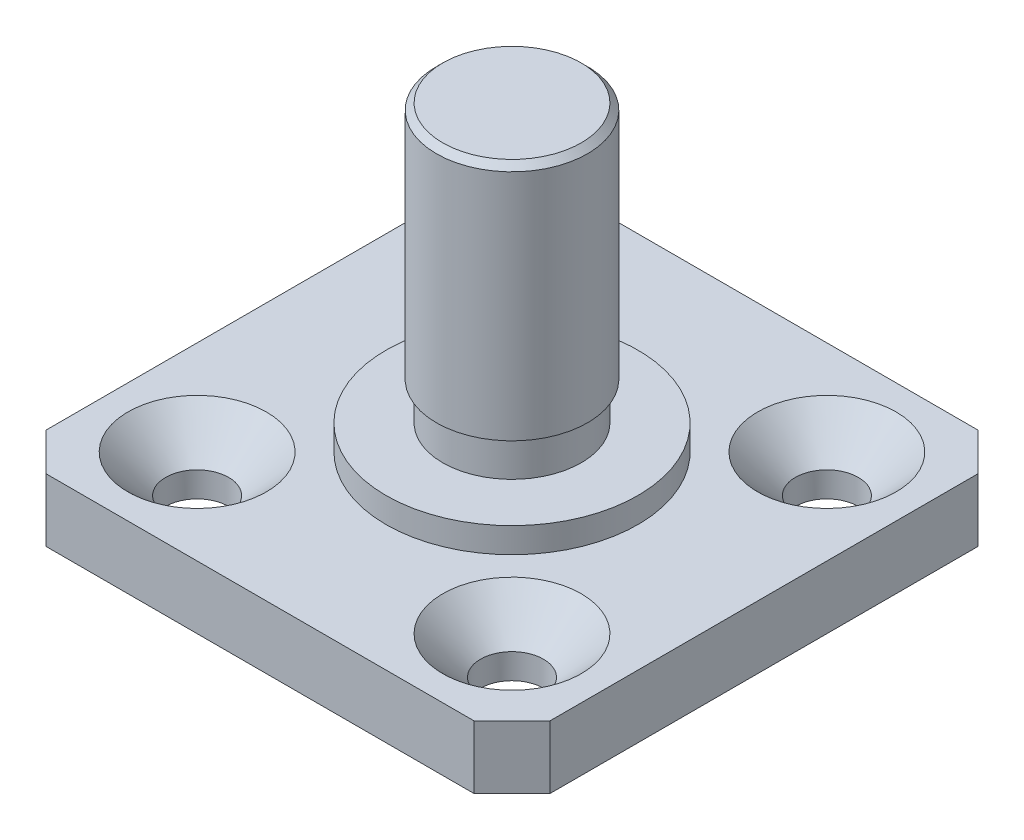
ISO-10303-21;
HEADER;
FILE_DESCRIPTION(('STEP AP214'),'2;1');
FILE_NAME('part.step','',(''),(''),'','','');
FILE_SCHEMA(('AUTOMOTIVE_DESIGN { 1 0 10303 214 1 1 1 1 }'));
ENDSEC;
DATA;
#1=APPLICATION_CONTEXT('core data for automotive mechanical design processes');
#2=APPLICATION_PROTOCOL_DEFINITION('international standard','automotive_design',2000,#1);
#3=PRODUCT_CONTEXT('',#1,'mechanical');
#4=PRODUCT('Part','Part','',(#3));
#5=PRODUCT_RELATED_PRODUCT_CATEGORY('part','',(#4));
#6=PRODUCT_DEFINITION_FORMATION('','',#4);
#7=PRODUCT_DEFINITION_CONTEXT('part definition',#1,'design');
#8=PRODUCT_DEFINITION('design','',#6,#7);
#9=PRODUCT_DEFINITION_SHAPE('','',#8);
#10=(LENGTH_UNIT() NAMED_UNIT(*) SI_UNIT(.MILLI.,.METRE.));
#11=(NAMED_UNIT(*) PLANE_ANGLE_UNIT() SI_UNIT($,.RADIAN.));
#12=(NAMED_UNIT(*) SI_UNIT($,.STERADIAN.) SOLID_ANGLE_UNIT());
#13=UNCERTAINTY_MEASURE_WITH_UNIT(LENGTH_MEASURE(1.E-05),#10,'distance_accuracy_value','');
#14=(GEOMETRIC_REPRESENTATION_CONTEXT(3) GLOBAL_UNCERTAINTY_ASSIGNED_CONTEXT((#13)) GLOBAL_UNIT_ASSIGNED_CONTEXT((#10,
#11,#12)) REPRESENTATION_CONTEXT('',''));
#15=CARTESIAN_POINT('',(0.,0.,0.));
#16=DIRECTION('',(0.,0.,1.));
#17=DIRECTION('',(1.,0.,0.));
#18=AXIS2_PLACEMENT_3D('',#15,#16,#17);
#19=CARTESIAN_POINT('',(20.,5.,20.));
#20=DIRECTION('',(-1.,0.,0.));
#21=DIRECTION('',(0.,0.,1.));
#22=AXIS2_PLACEMENT_3D('',#19,#20,#21);
#23=PLANE('',#22);
#24=DIRECTION('',(0.,0.,-1.));
#25=VECTOR('',#24,1.);
#26=CARTESIAN_POINT('',(20.,0.,20.));
#27=LINE('',#26,#25);
#28=CARTESIAN_POINT('',(20.,0.,17.));
#29=VERTEX_POINT('',#28);
#30=CARTESIAN_POINT('',(20.,0.,-17.));
#31=VERTEX_POINT('',#30);
#32=EDGE_CURVE('E139',#29,#31,#27,.T.);
#33=ORIENTED_EDGE('',*,*,#32,.T.);
#34=DIRECTION('',(0.,1.,0.));
#35=VECTOR('',#34,1.);
#36=CARTESIAN_POINT('',(20.,5.,-17.));
#37=LINE('',#36,#35);
#38=CARTESIAN_POINT('',(20.,5.,-17.));
#39=VERTEX_POINT('',#38);
#40=EDGE_CURVE('E161',#31,#39,#37,.T.);
#41=ORIENTED_EDGE('',*,*,#40,.T.);
#42=DIRECTION('',(0.,0.,-1.));
#43=VECTOR('',#42,1.);
#44=CARTESIAN_POINT('',(20.,5.,20.));
#45=LINE('',#44,#43);
#46=CARTESIAN_POINT('',(20.,5.,17.));
#47=VERTEX_POINT('',#46);
#48=EDGE_CURVE('E137',#47,#39,#45,.T.);
#49=ORIENTED_EDGE('',*,*,#48,.F.);
#50=DIRECTION('',(0.,-1.,0.));
#51=VECTOR('',#50,1.);
#52=CARTESIAN_POINT('',(20.,5.,17.));
#53=LINE('',#52,#51);
#54=EDGE_CURVE('E158',#47,#29,#53,.T.);
#55=ORIENTED_EDGE('',*,*,#54,.T.);
#56=EDGE_LOOP('',(#33,#41,#49,#55));
#57=FACE_BOUND('',#56,.T.);
#58=ADVANCED_FACE('F40',(#57),#23,.F.);
#59=CARTESIAN_POINT('',(-20.,5.,-20.));
#60=DIRECTION('',(0.,0.,1.));
#61=DIRECTION('',(1.,0.,0.));
#62=AXIS2_PLACEMENT_3D('',#59,#60,#61);
#63=PLANE('',#62);
#64=DIRECTION('',(-1.,0.,0.));
#65=VECTOR('',#64,1.);
#66=CARTESIAN_POINT('',(-20.,0.,-20.));
#67=LINE('',#66,#65);
#68=CARTESIAN_POINT('',(17.,0.,-20.));
#69=VERTEX_POINT('',#68);
#70=CARTESIAN_POINT('',(-17.,0.,-20.));
#71=VERTEX_POINT('',#70);
#72=EDGE_CURVE('E135',#69,#71,#67,.T.);
#73=ORIENTED_EDGE('',*,*,#72,.T.);
#74=DIRECTION('',(0.,1.,0.));
#75=VECTOR('',#74,1.);
#76=CARTESIAN_POINT('',(-17.,5.,-20.));
#77=LINE('',#76,#75);
#78=CARTESIAN_POINT('',(-17.,5.,-20.));
#79=VERTEX_POINT('',#78);
#80=EDGE_CURVE('E113',#71,#79,#77,.T.);
#81=ORIENTED_EDGE('',*,*,#80,.T.);
#82=DIRECTION('',(-1.,0.,0.));
#83=VECTOR('',#82,1.);
#84=CARTESIAN_POINT('',(-20.,5.,-20.));
#85=LINE('',#84,#83);
#86=CARTESIAN_POINT('',(17.,5.,-20.));
#87=VERTEX_POINT('',#86);
#88=EDGE_CURVE('E312',#87,#79,#85,.T.);
#89=ORIENTED_EDGE('',*,*,#88,.F.);
#90=DIRECTION('',(0.,-1.,0.));
#91=VECTOR('',#90,1.);
#92=CARTESIAN_POINT('',(17.,5.,-20.));
#93=LINE('',#92,#91);
#94=EDGE_CURVE('E118',#87,#69,#93,.T.);
#95=ORIENTED_EDGE('',*,*,#94,.T.);
#96=EDGE_LOOP('',(#73,#81,#89,#95));
#97=FACE_BOUND('',#96,.T.);
#98=ADVANCED_FACE('F206',(#97),#63,.F.);
#99=CARTESIAN_POINT('',(-20.,5.,20.));
#100=DIRECTION('',(1.,0.,0.));
#101=DIRECTION('',(0.,0.,-1.));
#102=AXIS2_PLACEMENT_3D('',#99,#100,#101);
#103=PLANE('',#102);
#104=DIRECTION('',(0.,0.,1.));
#105=VECTOR('',#104,1.);
#106=CARTESIAN_POINT('',(-20.,5.,20.));
#107=LINE('',#106,#105);
#108=CARTESIAN_POINT('',(-20.,5.,-17.));
#109=VERTEX_POINT('',#108);
#110=CARTESIAN_POINT('',(-20.,5.,17.));
#111=VERTEX_POINT('',#110);
#112=EDGE_CURVE('E127',#109,#111,#107,.T.);
#113=ORIENTED_EDGE('',*,*,#112,.F.);
#114=DIRECTION('',(0.,-1.,0.));
#115=VECTOR('',#114,1.);
#116=CARTESIAN_POINT('',(-20.,5.,-17.));
#117=LINE('',#116,#115);
#118=CARTESIAN_POINT('',(-20.,0.,-17.));
#119=VERTEX_POINT('',#118);
#120=EDGE_CURVE('E112',#109,#119,#117,.T.);
#121=ORIENTED_EDGE('',*,*,#120,.T.);
#122=DIRECTION('',(0.,0.,1.));
#123=VECTOR('',#122,1.);
#124=CARTESIAN_POINT('',(-20.,0.,20.));
#125=LINE('',#124,#123);
#126=CARTESIAN_POINT('',(-20.,0.,17.));
#127=VERTEX_POINT('',#126);
#128=EDGE_CURVE('E125',#119,#127,#125,.T.);
#129=ORIENTED_EDGE('',*,*,#128,.T.);
#130=DIRECTION('',(0.,1.,0.));
#131=VECTOR('',#130,1.);
#132=CARTESIAN_POINT('',(-20.,5.,17.));
#133=LINE('',#132,#131);
#134=EDGE_CURVE('E129',#127,#111,#133,.T.);
#135=ORIENTED_EDGE('',*,*,#134,.T.);
#136=EDGE_LOOP('',(#113,#121,#129,#135));
#137=FACE_BOUND('',#136,.T.);
#138=ADVANCED_FACE('F124',(#137),#103,.F.);
#139=CARTESIAN_POINT('',(-20.,5.,20.));
#140=DIRECTION('',(0.,0.,-1.));
#141=DIRECTION('',(-1.,0.,0.));
#142=AXIS2_PLACEMENT_3D('',#139,#140,#141);
#143=PLANE('',#142);
#144=DIRECTION('',(1.,0.,0.));
#145=VECTOR('',#144,1.);
#146=CARTESIAN_POINT('',(-20.,5.,20.));
#147=LINE('',#146,#145);
#148=CARTESIAN_POINT('',(-17.,5.,20.));
#149=VERTEX_POINT('',#148);
#150=CARTESIAN_POINT('',(17.,5.,20.));
#151=VERTEX_POINT('',#150);
#152=EDGE_CURVE('E143',#149,#151,#147,.T.);
#153=ORIENTED_EDGE('',*,*,#152,.F.);
#154=DIRECTION('',(0.,-1.,0.));
#155=VECTOR('',#154,1.);
#156=CARTESIAN_POINT('',(-17.,5.,20.));
#157=LINE('',#156,#155);
#158=CARTESIAN_POINT('',(-17.,0.,20.));
#159=VERTEX_POINT('',#158);
#160=EDGE_CURVE('E164',#149,#159,#157,.T.);
#161=ORIENTED_EDGE('',*,*,#160,.T.);
#162=DIRECTION('',(1.,0.,0.));
#163=VECTOR('',#162,1.);
#164=CARTESIAN_POINT('',(-20.,0.,20.));
#165=LINE('',#164,#163);
#166=CARTESIAN_POINT('',(17.,0.,20.));
#167=VERTEX_POINT('',#166);
#168=EDGE_CURVE('E134',#159,#167,#165,.T.);
#169=ORIENTED_EDGE('',*,*,#168,.T.);
#170=DIRECTION('',(0.,1.,0.));
#171=VECTOR('',#170,1.);
#172=CARTESIAN_POINT('',(17.,5.,20.));
#173=LINE('',#172,#171);
#174=EDGE_CURVE('E56',#167,#151,#173,.T.);
#175=ORIENTED_EDGE('',*,*,#174,.T.);
#176=EDGE_LOOP('',(#153,#161,#169,#175));
#177=FACE_BOUND('',#176,.T.);
#178=ADVANCED_FACE('F325',(#177),#143,.F.);
#179=CARTESIAN_POINT('',(0.,5.,0.));
#180=DIRECTION('',(0.,-1.,0.));
#181=DIRECTION('',(0.,0.,-1.));
#182=AXIS2_PLACEMENT_3D('',#179,#180,#181);
#183=PLANE('',#182);
#184=CARTESIAN_POINT('',(-12.5,5.,12.5));
#185=DIRECTION('',(0.,-1.,0.));
#186=DIRECTION('',(0.,0.,-1.));
#187=AXIS2_PLACEMENT_3D('',#184,#185,#186);
#188=CIRCLE('',#187,5.50000000000001);
#189=CARTESIAN_POINT('',(-12.5,5.,6.99999999999999));
#190=VERTEX_POINT('',#189);
#191=EDGE_CURVE('E180',#190,#190,#188,.T.);
#192=ORIENTED_EDGE('',*,*,#191,.T.);
#193=EDGE_LOOP('',(#192));
#194=FACE_BOUND('',#193,.T.);
#195=CARTESIAN_POINT('',(12.5,5.,12.5));
#196=DIRECTION('',(0.,-1.,0.));
#197=DIRECTION('',(0.,0.,-1.));
#198=AXIS2_PLACEMENT_3D('',#195,#196,#197);
#199=CIRCLE('',#198,5.50000000000001);
#200=CARTESIAN_POINT('',(12.5,5.,6.99999999999999));
#201=VERTEX_POINT('',#200);
#202=EDGE_CURVE('E177',#201,#201,#199,.T.);
#203=ORIENTED_EDGE('',*,*,#202,.T.);
#204=EDGE_LOOP('',(#203));
#205=FACE_BOUND('',#204,.T.);
#206=CARTESIAN_POINT('',(12.5,5.,-12.5));
#207=DIRECTION('',(0.,-1.,0.));
#208=DIRECTION('',(0.,0.,-1.));
#209=AXIS2_PLACEMENT_3D('',#206,#207,#208);
#210=CIRCLE('',#209,5.50000000000001);
#211=CARTESIAN_POINT('',(12.5,5.,-18.));
#212=VERTEX_POINT('',#211);
#213=EDGE_CURVE('E174',#212,#212,#210,.T.);
#214=ORIENTED_EDGE('',*,*,#213,.T.);
#215=EDGE_LOOP('',(#214));
#216=FACE_BOUND('',#215,.T.);
#217=CARTESIAN_POINT('',(-12.5,5.,-12.5));
#218=DIRECTION('',(0.,-1.,0.));
#219=DIRECTION('',(0.,0.,-1.));
#220=AXIS2_PLACEMENT_3D('',#217,#218,#219);
#221=CIRCLE('',#220,5.50000000000003);
#222=CARTESIAN_POINT('',(-12.5,5.,-18.));
#223=VERTEX_POINT('',#222);
#224=EDGE_CURVE('E171',#223,#223,#221,.T.);
#225=ORIENTED_EDGE('',*,*,#224,.T.);
#226=EDGE_LOOP('',(#225));
#227=FACE_BOUND('',#226,.T.);
#228=CARTESIAN_POINT('',(0.,5.,0.));
#229=DIRECTION('',(0.,1.,0.));
#230=DIRECTION('',(0.,0.,1.));
#231=AXIS2_PLACEMENT_3D('',#228,#229,#230);
#232=CIRCLE('',#231,10.);
#233=CARTESIAN_POINT('',(0.,5.,10.));
#234=VERTEX_POINT('',#233);
#235=EDGE_CURVE('E167',#234,#234,#232,.T.);
#236=ORIENTED_EDGE('',*,*,#235,.F.);
#237=EDGE_LOOP('',(#236));
#238=FACE_BOUND('',#237,.T.);
#239=ORIENTED_EDGE('',*,*,#88,.T.);
#240=DIRECTION('',(0.707106781186548,0.,-0.707106781186547));
#241=VECTOR('',#240,1.);
#242=CARTESIAN_POINT('',(-20.,5.,-17.));
#243=LINE('',#242,#241);
#244=EDGE_CURVE('E156',#79,#109,#243,.F.);
#245=ORIENTED_EDGE('',*,*,#244,.T.);
#246=ORIENTED_EDGE('',*,*,#112,.T.);
#247=DIRECTION('',(-0.707106781186547,0.,-0.707106781186548));
#248=VECTOR('',#247,1.);
#249=CARTESIAN_POINT('',(-17.,5.,20.));
#250=LINE('',#249,#248);
#251=EDGE_CURVE('E63',#111,#149,#250,.F.);
#252=ORIENTED_EDGE('',*,*,#251,.T.);
#253=ORIENTED_EDGE('',*,*,#152,.T.);
#254=DIRECTION('',(-0.707106781186548,0.,0.707106781186547));
#255=VECTOR('',#254,1.);
#256=CARTESIAN_POINT('',(20.,5.,17.));
#257=LINE('',#256,#255);
#258=EDGE_CURVE('E151',#151,#47,#257,.F.);
#259=ORIENTED_EDGE('',*,*,#258,.T.);
#260=ORIENTED_EDGE('',*,*,#48,.T.);
#261=DIRECTION('',(0.707106781186547,0.,0.707106781186548));
#262=VECTOR('',#261,1.);
#263=CARTESIAN_POINT('',(17.,5.,-20.));
#264=LINE('',#263,#262);
#265=EDGE_CURVE('E154',#39,#87,#264,.F.);
#266=ORIENTED_EDGE('',*,*,#265,.T.);
#267=EDGE_LOOP('',(#239,#245,#246,#252,#253,#259,#260,#266));
#268=FACE_BOUND('',#267,.T.);
#269=ADVANCED_FACE('F323',(#194,#205,#216,#227,#238,#268),#183,.F.);
#270=CARTESIAN_POINT('',(0.,0.,0.));
#271=DIRECTION('',(0.,-1.,0.));
#272=DIRECTION('',(0.,0.,-1.));
#273=AXIS2_PLACEMENT_3D('',#270,#271,#272);
#274=PLANE('',#273);
#275=CARTESIAN_POINT('',(-12.5,0.,12.5));
#276=DIRECTION('',(0.,1.,0.));
#277=DIRECTION('',(0.,0.,1.));
#278=AXIS2_PLACEMENT_3D('',#275,#276,#277);
#279=CIRCLE('',#278,2.5);
#280=CARTESIAN_POINT('',(-12.5,0.,15.));
#281=VERTEX_POINT('',#280);
#282=EDGE_CURVE('E292',#281,#281,#279,.T.);
#283=ORIENTED_EDGE('',*,*,#282,.T.);
#284=EDGE_LOOP('',(#283));
#285=FACE_BOUND('',#284,.T.);
#286=CARTESIAN_POINT('',(12.5,0.,12.5));
#287=DIRECTION('',(0.,1.,0.));
#288=DIRECTION('',(0.,0.,1.));
#289=AXIS2_PLACEMENT_3D('',#286,#287,#288);
#290=CIRCLE('',#289,2.5);
#291=CARTESIAN_POINT('',(12.5,0.,15.));
#292=VERTEX_POINT('',#291);
#293=EDGE_CURVE('E286',#292,#292,#290,.T.);
#294=ORIENTED_EDGE('',*,*,#293,.T.);
#295=EDGE_LOOP('',(#294));
#296=FACE_BOUND('',#295,.T.);
#297=CARTESIAN_POINT('',(12.5,0.,-12.5));
#298=DIRECTION('',(0.,1.,0.));
#299=DIRECTION('',(0.,0.,1.));
#300=AXIS2_PLACEMENT_3D('',#297,#298,#299);
#301=CIRCLE('',#300,2.5);
#302=CARTESIAN_POINT('',(12.5,0.,-10.));
#303=VERTEX_POINT('',#302);
#304=EDGE_CURVE('E283',#303,#303,#301,.T.);
#305=ORIENTED_EDGE('',*,*,#304,.T.);
#306=EDGE_LOOP('',(#305));
#307=FACE_BOUND('',#306,.T.);
#308=CARTESIAN_POINT('',(-12.5,0.,-12.5));
#309=DIRECTION('',(0.,1.,0.));
#310=DIRECTION('',(0.,0.,1.));
#311=AXIS2_PLACEMENT_3D('',#308,#309,#310);
#312=CIRCLE('',#311,2.5);
#313=CARTESIAN_POINT('',(-12.5,0.,-10.));
#314=VERTEX_POINT('',#313);
#315=EDGE_CURVE('E285',#314,#314,#312,.T.);
#316=ORIENTED_EDGE('',*,*,#315,.T.);
#317=EDGE_LOOP('',(#316));
#318=FACE_BOUND('',#317,.T.);
#319=ORIENTED_EDGE('',*,*,#128,.F.);
#320=DIRECTION('',(-0.707106781186548,0.,0.707106781186547));
#321=VECTOR('',#320,1.);
#322=CARTESIAN_POINT('',(-18.5,0.,-18.5));
#323=LINE('',#322,#321);
#324=EDGE_CURVE('E108',#119,#71,#323,.F.);
#325=ORIENTED_EDGE('',*,*,#324,.T.);
#326=ORIENTED_EDGE('',*,*,#72,.F.);
#327=DIRECTION('',(-0.707106781186547,0.,-0.707106781186548));
#328=VECTOR('',#327,1.);
#329=CARTESIAN_POINT('',(18.5,0.,-18.5));
#330=LINE('',#329,#328);
#331=EDGE_CURVE('E119',#69,#31,#330,.F.);
#332=ORIENTED_EDGE('',*,*,#331,.T.);
#333=ORIENTED_EDGE('',*,*,#32,.F.);
#334=DIRECTION('',(0.707106781186548,0.,-0.707106781186547));
#335=VECTOR('',#334,1.);
#336=CARTESIAN_POINT('',(18.5,0.,18.5));
#337=LINE('',#336,#335);
#338=EDGE_CURVE('E128',#29,#167,#337,.F.);
#339=ORIENTED_EDGE('',*,*,#338,.T.);
#340=ORIENTED_EDGE('',*,*,#168,.F.);
#341=DIRECTION('',(0.707106781186547,0.,0.707106781186548));
#342=VECTOR('',#341,1.);
#343=CARTESIAN_POINT('',(-18.5,0.,18.5));
#344=LINE('',#343,#342);
#345=EDGE_CURVE('E133',#159,#127,#344,.F.);
#346=ORIENTED_EDGE('',*,*,#345,.T.);
#347=EDGE_LOOP('',(#319,#325,#326,#332,#333,#339,#340,#346));
#348=FACE_BOUND('',#347,.T.);
#349=ADVANCED_FACE('F131',(#285,#296,#307,#318,#348),#274,.T.);
#350=CARTESIAN_POINT('',(-20.,5.,-17.));
#351=DIRECTION('',(0.707106781186547,0.,0.707106781186548));
#352=DIRECTION('',(0.,-1.,0.));
#353=AXIS2_PLACEMENT_3D('',#350,#351,#352);
#354=PLANE('',#353);
#355=ORIENTED_EDGE('',*,*,#244,.F.);
#356=ORIENTED_EDGE('',*,*,#80,.F.);
#357=ORIENTED_EDGE('',*,*,#324,.F.);
#358=ORIENTED_EDGE('',*,*,#120,.F.);
#359=EDGE_LOOP('',(#355,#356,#357,#358));
#360=FACE_BOUND('',#359,.T.);
#361=ADVANCED_FACE('F111',(#360),#354,.F.);
#362=CARTESIAN_POINT('',(17.,5.,-20.));
#363=DIRECTION('',(-0.707106781186548,0.,0.707106781186547));
#364=DIRECTION('',(0.,-1.,0.));
#365=AXIS2_PLACEMENT_3D('',#362,#363,#364);
#366=PLANE('',#365);
#367=ORIENTED_EDGE('',*,*,#265,.F.);
#368=ORIENTED_EDGE('',*,*,#40,.F.);
#369=ORIENTED_EDGE('',*,*,#331,.F.);
#370=ORIENTED_EDGE('',*,*,#94,.F.);
#371=EDGE_LOOP('',(#367,#368,#369,#370));
#372=FACE_BOUND('',#371,.T.);
#373=ADVANCED_FACE('F223',(#372),#366,.F.);
#374=CARTESIAN_POINT('',(-17.,5.,20.));
#375=DIRECTION('',(0.707106781186548,0.,-0.707106781186547));
#376=DIRECTION('',(0.,-1.,0.));
#377=AXIS2_PLACEMENT_3D('',#374,#375,#376);
#378=PLANE('',#377);
#379=ORIENTED_EDGE('',*,*,#251,.F.);
#380=ORIENTED_EDGE('',*,*,#134,.F.);
#381=ORIENTED_EDGE('',*,*,#345,.F.);
#382=ORIENTED_EDGE('',*,*,#160,.F.);
#383=EDGE_LOOP('',(#379,#380,#381,#382));
#384=FACE_BOUND('',#383,.T.);
#385=ADVANCED_FACE('F229',(#384),#378,.F.);
#386=CARTESIAN_POINT('',(20.,5.,17.));
#387=DIRECTION('',(-0.707106781186547,0.,-0.707106781186548));
#388=DIRECTION('',(0.,-1.,0.));
#389=AXIS2_PLACEMENT_3D('',#386,#387,#388);
#390=PLANE('',#389);
#391=ORIENTED_EDGE('',*,*,#258,.F.);
#392=ORIENTED_EDGE('',*,*,#174,.F.);
#393=ORIENTED_EDGE('',*,*,#338,.F.);
#394=ORIENTED_EDGE('',*,*,#54,.F.);
#395=EDGE_LOOP('',(#391,#392,#393,#394));
#396=FACE_BOUND('',#395,.T.);
#397=ADVANCED_FACE('F236',(#396),#390,.F.);
#398=CARTESIAN_POINT('',(0.,7.,0.));
#399=DIRECTION('',(0.,-1.,0.));
#400=DIRECTION('',(0.,0.,-1.));
#401=AXIS2_PLACEMENT_3D('',#398,#399,#400);
#402=CYLINDRICAL_SURFACE('',#401,10.);
#403=CARTESIAN_POINT('',(0.,7.,0.));
#404=DIRECTION('',(0.,1.,0.));
#405=DIRECTION('',(0.,0.,1.));
#406=AXIS2_PLACEMENT_3D('',#403,#404,#405);
#407=CIRCLE('',#406,10.);
#408=CARTESIAN_POINT('',(0.,7.,10.));
#409=VERTEX_POINT('',#408);
#410=EDGE_CURVE('E305',#409,#409,#407,.T.);
#411=ORIENTED_EDGE('',*,*,#410,.F.);
#412=EDGE_LOOP('',(#411));
#413=FACE_BOUND('',#412,.T.);
#414=ORIENTED_EDGE('',*,*,#235,.T.);
#415=EDGE_LOOP('',(#414));
#416=FACE_BOUND('',#415,.T.);
#417=ADVANCED_FACE('F243',(#413,#416),#402,.T.);
#418=CARTESIAN_POINT('',(0.,7.,0.));
#419=DIRECTION('',(0.,1.,0.));
#420=DIRECTION('',(0.,0.,1.));
#421=AXIS2_PLACEMENT_3D('',#418,#419,#420);
#422=PLANE('',#421);
#423=ORIENTED_EDGE('',*,*,#410,.T.);
#424=EDGE_LOOP('',(#423));
#425=FACE_BOUND('',#424,.T.);
#426=CARTESIAN_POINT('',(0.,7.,0.));
#427=DIRECTION('',(0.,1.,0.));
#428=DIRECTION('',(0.,0.,1.));
#429=AXIS2_PLACEMENT_3D('',#426,#427,#428);
#430=CIRCLE('',#429,5.5);
#431=CARTESIAN_POINT('',(0.,7.,5.5));
#432=VERTEX_POINT('',#431);
#433=EDGE_CURVE('E289',#432,#432,#430,.T.);
#434=ORIENTED_EDGE('',*,*,#433,.F.);
#435=EDGE_LOOP('',(#434));
#436=FACE_BOUND('',#435,.T.);
#437=ADVANCED_FACE('F341',(#425,#436),#422,.T.);
#438=CARTESIAN_POINT('',(0.,10.,0.));
#439=DIRECTION('',(0.,1.,0.));
#440=DIRECTION('',(0.,0.,1.));
#441=AXIS2_PLACEMENT_3D('',#438,#439,#440);
#442=PLANE('',#441);
#443=CARTESIAN_POINT('',(0.,10.,0.));
#444=DIRECTION('',(0.,1.,0.));
#445=DIRECTION('',(0.,0.,1.));
#446=AXIS2_PLACEMENT_3D('',#443,#444,#445);
#447=CIRCLE('',#446,6.);
#448=CARTESIAN_POINT('',(0.,10.,6.));
#449=VERTEX_POINT('',#448);
#450=EDGE_CURVE('E300',#449,#449,#447,.T.);
#451=ORIENTED_EDGE('',*,*,#450,.F.);
#452=EDGE_LOOP('',(#451));
#453=FACE_BOUND('',#452,.T.);
#454=CARTESIAN_POINT('',(0.,10.,0.));
#455=DIRECTION('',(0.,1.,0.));
#456=DIRECTION('',(0.,0.,1.));
#457=AXIS2_PLACEMENT_3D('',#454,#455,#456);
#458=CIRCLE('',#457,5.5);
#459=CARTESIAN_POINT('',(0.,10.,5.5));
#460=VERTEX_POINT('',#459);
#461=EDGE_CURVE('E297',#460,#460,#458,.T.);
#462=ORIENTED_EDGE('',*,*,#461,.T.);
#463=EDGE_LOOP('',(#462));
#464=FACE_BOUND('',#463,.T.);
#465=ADVANCED_FACE('F345',(#453,#464),#442,.F.);
#466=CARTESIAN_POINT('',(0.,10.,0.));
#467=DIRECTION('',(0.,-1.,0.));
#468=DIRECTION('',(0.,0.,-1.));
#469=AXIS2_PLACEMENT_3D('',#466,#467,#468);
#470=CYLINDRICAL_SURFACE('',#469,5.5);
#471=ORIENTED_EDGE('',*,*,#461,.F.);
#472=EDGE_LOOP('',(#471));
#473=FACE_BOUND('',#472,.T.);
#474=ORIENTED_EDGE('',*,*,#433,.T.);
#475=EDGE_LOOP('',(#474));
#476=FACE_BOUND('',#475,.T.);
#477=ADVANCED_FACE('F353',(#473,#476),#470,.T.);
#478=CARTESIAN_POINT('',(0.,29.,0.));
#479=DIRECTION('',(0.,1.,0.));
#480=DIRECTION('',(0.,0.,1.));
#481=AXIS2_PLACEMENT_3D('',#478,#479,#480);
#482=PLANE('',#481);
#483=CARTESIAN_POINT('',(0.,29.,0.));
#484=DIRECTION('',(0.,1.,0.));
#485=DIRECTION('',(0.,0.,1.));
#486=AXIS2_PLACEMENT_3D('',#483,#484,#485);
#487=CIRCLE('',#486,5.49999999999999);
#488=CARTESIAN_POINT('',(0.,29.,5.49999999999999));
#489=VERTEX_POINT('',#488);
#490=EDGE_CURVE('E49',#489,#489,#487,.T.);
#491=ORIENTED_EDGE('',*,*,#490,.T.);
#492=EDGE_LOOP('',(#491));
#493=FACE_BOUND('',#492,.T.);
#494=ADVANCED_FACE('F194',(#493),#482,.T.);
#495=CARTESIAN_POINT('',(0.,29.,0.));
#496=DIRECTION('',(0.,-1.,0.));
#497=DIRECTION('',(0.,0.,-1.));
#498=AXIS2_PLACEMENT_3D('',#495,#496,#497);
#499=CYLINDRICAL_SURFACE('',#498,6.);
#500=CARTESIAN_POINT('',(0.,28.5,0.));
#501=DIRECTION('',(0.,1.,0.));
#502=DIRECTION('',(0.,0.,1.));
#503=AXIS2_PLACEMENT_3D('',#500,#501,#502);
#504=CIRCLE('',#503,6.);
#505=CARTESIAN_POINT('',(0.,28.5,6.));
#506=VERTEX_POINT('',#505);
#507=EDGE_CURVE('E11',#506,#506,#504,.F.);
#508=ORIENTED_EDGE('',*,*,#507,.T.);
#509=EDGE_LOOP('',(#508));
#510=FACE_BOUND('',#509,.T.);
#511=ORIENTED_EDGE('',*,*,#450,.T.);
#512=EDGE_LOOP('',(#511));
#513=FACE_BOUND('',#512,.T.);
#514=ADVANCED_FACE('F347',(#510,#513),#499,.T.);
#515=CARTESIAN_POINT('',(-12.5,0.,-12.5));
#516=DIRECTION('',(0.,1.,0.));
#517=DIRECTION('',(0.,0.,1.));
#518=AXIS2_PLACEMENT_3D('',#515,#516,#517);
#519=CYLINDRICAL_SURFACE('',#518,2.5);
#520=CARTESIAN_POINT('',(-12.5,1.99999999999998,-12.5));
#521=DIRECTION('',(0.,-1.,0.));
#522=DIRECTION('',(0.,0.,-1.));
#523=AXIS2_PLACEMENT_3D('',#520,#521,#522);
#524=CIRCLE('',#523,2.5);
#525=CARTESIAN_POINT('',(-12.5,1.99999999999998,-15.));
#526=VERTEX_POINT('',#525);
#527=EDGE_CURVE('E189',#526,#526,#524,.F.);
#528=ORIENTED_EDGE('',*,*,#527,.T.);
#529=EDGE_LOOP('',(#528));
#530=FACE_BOUND('',#529,.T.);
#531=ORIENTED_EDGE('',*,*,#315,.F.);
#532=EDGE_LOOP('',(#531));
#533=FACE_BOUND('',#532,.T.);
#534=ADVANCED_FACE('F279',(#530,#533),#519,.F.);
#535=CARTESIAN_POINT('',(12.5,0.,-12.5));
#536=DIRECTION('',(0.,1.,0.));
#537=DIRECTION('',(0.,0.,1.));
#538=AXIS2_PLACEMENT_3D('',#535,#536,#537);
#539=CYLINDRICAL_SURFACE('',#538,2.5);
#540=CARTESIAN_POINT('',(12.5,2.,-12.5));
#541=DIRECTION('',(0.,-1.,0.));
#542=DIRECTION('',(0.,0.,-1.));
#543=AXIS2_PLACEMENT_3D('',#540,#541,#542);
#544=CIRCLE('',#543,2.5);
#545=CARTESIAN_POINT('',(12.5,2.,-15.));
#546=VERTEX_POINT('',#545);
#547=EDGE_CURVE('E186',#546,#546,#544,.F.);
#548=ORIENTED_EDGE('',*,*,#547,.T.);
#549=EDGE_LOOP('',(#548));
#550=FACE_BOUND('',#549,.T.);
#551=ORIENTED_EDGE('',*,*,#304,.F.);
#552=EDGE_LOOP('',(#551));
#553=FACE_BOUND('',#552,.T.);
#554=ADVANCED_FACE('F275',(#550,#553),#539,.F.);
#555=CARTESIAN_POINT('',(12.5,0.,12.5));
#556=DIRECTION('',(0.,1.,0.));
#557=DIRECTION('',(0.,0.,1.));
#558=AXIS2_PLACEMENT_3D('',#555,#556,#557);
#559=CYLINDRICAL_SURFACE('',#558,2.5);
#560=CARTESIAN_POINT('',(12.5,2.,12.5));
#561=DIRECTION('',(0.,-1.,0.));
#562=DIRECTION('',(0.,0.,-1.));
#563=AXIS2_PLACEMENT_3D('',#560,#561,#562);
#564=CIRCLE('',#563,2.5);
#565=CARTESIAN_POINT('',(12.5,2.,10.));
#566=VERTEX_POINT('',#565);
#567=EDGE_CURVE('E183',#566,#566,#564,.F.);
#568=ORIENTED_EDGE('',*,*,#567,.T.);
#569=EDGE_LOOP('',(#568));
#570=FACE_BOUND('',#569,.T.);
#571=ORIENTED_EDGE('',*,*,#293,.F.);
#572=EDGE_LOOP('',(#571));
#573=FACE_BOUND('',#572,.T.);
#574=ADVANCED_FACE('F278',(#570,#573),#559,.F.);
#575=CARTESIAN_POINT('',(-12.5,0.,12.5));
#576=DIRECTION('',(0.,1.,0.));
#577=DIRECTION('',(0.,0.,1.));
#578=AXIS2_PLACEMENT_3D('',#575,#576,#577);
#579=CYLINDRICAL_SURFACE('',#578,2.5);
#580=CARTESIAN_POINT('',(-12.5,2.,12.5));
#581=DIRECTION('',(0.,-1.,0.));
#582=DIRECTION('',(0.,0.,-1.));
#583=AXIS2_PLACEMENT_3D('',#580,#581,#582);
#584=CIRCLE('',#583,2.5);
#585=CARTESIAN_POINT('',(-12.5,2.,10.));
#586=VERTEX_POINT('',#585);
#587=EDGE_CURVE('E168',#586,#586,#584,.F.);
#588=ORIENTED_EDGE('',*,*,#587,.T.);
#589=EDGE_LOOP('',(#588));
#590=FACE_BOUND('',#589,.T.);
#591=ORIENTED_EDGE('',*,*,#282,.F.);
#592=EDGE_LOOP('',(#591));
#593=FACE_BOUND('',#592,.T.);
#594=ADVANCED_FACE('F252',(#590,#593),#579,.F.);
#595=CARTESIAN_POINT('',(-12.5,2.,12.5));
#596=DIRECTION('',(0.,1.,0.));
#597=DIRECTION('',(0.,0.,1.));
#598=AXIS2_PLACEMENT_3D('',#595,#596,#597);
#599=CONICAL_SURFACE('',#598,2.5,0.78539816339745);
#600=ORIENTED_EDGE('',*,*,#191,.F.);
#601=EDGE_LOOP('',(#600));
#602=FACE_BOUND('',#601,.T.);
#603=ORIENTED_EDGE('',*,*,#587,.F.);
#604=EDGE_LOOP('',(#603));
#605=FACE_BOUND('',#604,.T.);
#606=ADVANCED_FACE('F245',(#602,#605),#599,.F.);
#607=CARTESIAN_POINT('',(12.5,2.,12.5));
#608=DIRECTION('',(0.,1.,0.));
#609=DIRECTION('',(0.,0.,1.));
#610=AXIS2_PLACEMENT_3D('',#607,#608,#609);
#611=CONICAL_SURFACE('',#610,2.5,0.78539816339745);
#612=ORIENTED_EDGE('',*,*,#202,.F.);
#613=EDGE_LOOP('',(#612));
#614=FACE_BOUND('',#613,.T.);
#615=ORIENTED_EDGE('',*,*,#567,.F.);
#616=EDGE_LOOP('',(#615));
#617=FACE_BOUND('',#616,.T.);
#618=ADVANCED_FACE('F251',(#614,#617),#611,.F.);
#619=CARTESIAN_POINT('',(12.5,2.,-12.5));
#620=DIRECTION('',(0.,1.,0.));
#621=DIRECTION('',(0.,0.,1.));
#622=AXIS2_PLACEMENT_3D('',#619,#620,#621);
#623=CONICAL_SURFACE('',#622,2.5,0.78539816339745);
#624=ORIENTED_EDGE('',*,*,#213,.F.);
#625=EDGE_LOOP('',(#624));
#626=FACE_BOUND('',#625,.T.);
#627=ORIENTED_EDGE('',*,*,#547,.F.);
#628=EDGE_LOOP('',(#627));
#629=FACE_BOUND('',#628,.T.);
#630=ADVANCED_FACE('F202',(#626,#629),#623,.F.);
#631=CARTESIAN_POINT('',(-12.5,1.99999999999998,-12.5));
#632=DIRECTION('',(0.,1.,0.));
#633=DIRECTION('',(0.,0.,1.));
#634=AXIS2_PLACEMENT_3D('',#631,#632,#633);
#635=CONICAL_SURFACE('',#634,2.5,0.78539816339745);
#636=ORIENTED_EDGE('',*,*,#224,.F.);
#637=EDGE_LOOP('',(#636));
#638=FACE_BOUND('',#637,.T.);
#639=ORIENTED_EDGE('',*,*,#527,.F.);
#640=EDGE_LOOP('',(#639));
#641=FACE_BOUND('',#640,.T.);
#642=ADVANCED_FACE('F197',(#638,#641),#635,.F.);
#643=CARTESIAN_POINT('',(0.,29.,0.));
#644=DIRECTION('',(0.,-1.,0.));
#645=DIRECTION('',(0.,0.,-1.));
#646=AXIS2_PLACEMENT_3D('',#643,#644,#645);
#647=CONICAL_SURFACE('',#646,5.49999999999999,0.785398163397447);
#648=ORIENTED_EDGE('',*,*,#507,.F.);
#649=EDGE_LOOP('',(#648));
#650=FACE_BOUND('',#649,.T.);
#651=ORIENTED_EDGE('',*,*,#490,.F.);
#652=EDGE_LOOP('',(#651));
#653=FACE_BOUND('',#652,.T.);
#654=ADVANCED_FACE('F43',(#650,#653),#647,.T.);
#655=CLOSED_SHELL('',(#58,#98,#138,#178,#269,#349,#361,#373,#385,#397,#417,#437,#465,#477,#494,
#514,#534,#554,#574,#594,#606,#618,#630,#642,#654));
#656=MANIFOLD_SOLID_BREP('B2',#655);
#657=ADVANCED_BREP_SHAPE_REPRESENTATION('',(#18,#656),#14);
#658=SHAPE_DEFINITION_REPRESENTATION(#9,#657);
ENDSEC;
END-ISO-10303-21;
